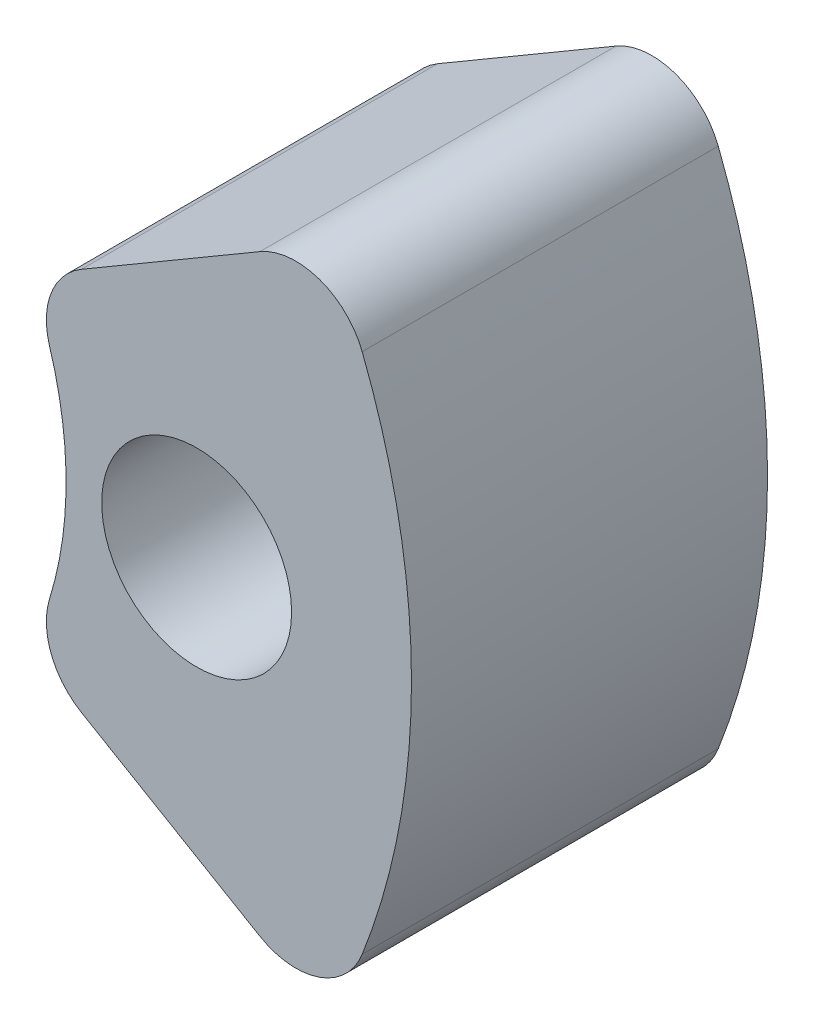
ISO-10303-21;
HEADER;
FILE_DESCRIPTION(('STEP AP214'),'2;1');
FILE_NAME('part.step','',(''),(''),'','','');
FILE_SCHEMA(('AUTOMOTIVE_DESIGN { 1 0 10303 214 1 1 1 1 }'));
ENDSEC;
DATA;
#1=APPLICATION_CONTEXT('core data for automotive mechanical design processes');
#2=APPLICATION_PROTOCOL_DEFINITION('international standard','automotive_design',2000,#1);
#3=PRODUCT_CONTEXT('',#1,'mechanical');
#4=PRODUCT('Part','Part','',(#3));
#5=PRODUCT_RELATED_PRODUCT_CATEGORY('part','',(#4));
#6=PRODUCT_DEFINITION_FORMATION('','',#4);
#7=PRODUCT_DEFINITION_CONTEXT('part definition',#1,'design');
#8=PRODUCT_DEFINITION('design','',#6,#7);
#9=PRODUCT_DEFINITION_SHAPE('','',#8);
#10=(LENGTH_UNIT() NAMED_UNIT(*) SI_UNIT(.MILLI.,.METRE.));
#11=(NAMED_UNIT(*) PLANE_ANGLE_UNIT() SI_UNIT($,.RADIAN.));
#12=(NAMED_UNIT(*) SI_UNIT($,.STERADIAN.) SOLID_ANGLE_UNIT());
#13=UNCERTAINTY_MEASURE_WITH_UNIT(LENGTH_MEASURE(1.E-05),#10,'distance_accuracy_value','');
#14=(GEOMETRIC_REPRESENTATION_CONTEXT(3) GLOBAL_UNCERTAINTY_ASSIGNED_CONTEXT((#13)) GLOBAL_UNIT_ASSIGNED_CONTEXT((#10,
#11,#12)) REPRESENTATION_CONTEXT('',''));
#15=CARTESIAN_POINT('',(0.,0.,0.));
#16=DIRECTION('',(0.,0.,1.));
#17=DIRECTION('',(1.,0.,0.));
#18=AXIS2_PLACEMENT_3D('',#15,#16,#17);
#19=CARTESIAN_POINT('',(25.280674437206,9.9,15.));
#20=DIRECTION('',(0.,0.,-1.));
#21=DIRECTION('',(-1.,0.,0.));
#22=AXIS2_PLACEMENT_3D('',#19,#20,#21);
#23=CYLINDRICAL_SURFACE('',#22,3.);
#24=CARTESIAN_POINT('',(25.280674437206,9.9,0.));
#25=DIRECTION('',(0.,0.,1.));
#26=DIRECTION('',(-1.,0.,0.));
#27=AXIS2_PLACEMENT_3D('',#24,#25,#26);
#28=CIRCLE('',#27,3.);
#29=CARTESIAN_POINT('',(28.0741191264,10.9939226519337,0.));
#30=VERTEX_POINT('',#29);
#31=CARTESIAN_POINT('',(23.7645025573319,12.4886720206853,0.));
#32=VERTEX_POINT('',#31);
#33=EDGE_CURVE('E141',#30,#32,#28,.T.);
#34=ORIENTED_EDGE('',*,*,#33,.T.);
#35=DIRECTION('',(0.,0.,-1.));
#36=VECTOR('',#35,1.);
#37=CARTESIAN_POINT('',(23.7645025573319,12.4886720206853,15.));
#38=LINE('',#37,#36);
#39=CARTESIAN_POINT('',(23.7645025573319,12.4886720206853,15.));
#40=VERTEX_POINT('',#39);
#41=EDGE_CURVE('E11',#40,#32,#38,.T.);
#42=ORIENTED_EDGE('',*,*,#41,.F.);
#43=CARTESIAN_POINT('',(25.280674437206,9.9,15.));
#44=DIRECTION('',(0.,0.,1.));
#45=DIRECTION('',(-1.,0.,0.));
#46=AXIS2_PLACEMENT_3D('',#43,#44,#45);
#47=CIRCLE('',#46,3.);
#48=CARTESIAN_POINT('',(28.0741191264,10.9939226519337,15.));
#49=VERTEX_POINT('',#48);
#50=EDGE_CURVE('E163',#49,#40,#47,.T.);
#51=ORIENTED_EDGE('',*,*,#50,.F.);
#52=DIRECTION('',(0.,0.,-1.));
#53=VECTOR('',#52,1.);
#54=CARTESIAN_POINT('',(28.0741191264,10.9939226519337,15.));
#55=LINE('',#54,#53);
#56=EDGE_CURVE('E137',#49,#30,#55,.T.);
#57=ORIENTED_EDGE('',*,*,#56,.T.);
#58=EDGE_LOOP('',(#34,#42,#51,#57));
#59=FACE_BOUND('',#58,.T.);
#60=ADVANCED_FACE('F39',(#59),#23,.T.);
#61=CARTESIAN_POINT('',(16.2520581951784,8.08867202068535,15.));
#62=DIRECTION('',(0.505390626624686,-0.862890673561783,0.));
#63=DIRECTION('',(0.862890673561783,0.505390626624686,0.));
#64=AXIS2_PLACEMENT_3D('',#61,#62,#63);
#65=PLANE('',#64);
#66=DIRECTION('',(-0.862890673561783,-0.505390626624686,0.));
#67=VECTOR('',#66,1.);
#68=CARTESIAN_POINT('',(16.2520581951784,8.08867202068535,0.));
#69=LINE('',#68,#67);
#70=CARTESIAN_POINT('',(16.2520581951784,8.08867202068535,0.));
#71=VERTEX_POINT('',#70);
#72=EDGE_CURVE('E145',#32,#71,#69,.T.);
#73=ORIENTED_EDGE('',*,*,#72,.T.);
#74=DIRECTION('',(0.,0.,-1.));
#75=VECTOR('',#74,1.);
#76=CARTESIAN_POINT('',(16.2520581951784,8.08867202068535,15.));
#77=LINE('',#76,#75);
#78=CARTESIAN_POINT('',(16.2520581951784,8.08867202068535,15.));
#79=VERTEX_POINT('',#78);
#80=EDGE_CURVE('E49',#79,#71,#77,.T.);
#81=ORIENTED_EDGE('',*,*,#80,.F.);
#82=DIRECTION('',(-0.862890673561783,-0.505390626624686,0.));
#83=VECTOR('',#82,1.);
#84=CARTESIAN_POINT('',(16.2520581951784,8.08867202068535,15.));
#85=LINE('',#84,#83);
#86=EDGE_CURVE('E100',#40,#79,#85,.T.);
#87=ORIENTED_EDGE('',*,*,#86,.F.);
#88=ORIENTED_EDGE('',*,*,#41,.T.);
#89=EDGE_LOOP('',(#73,#81,#87,#88));
#90=FACE_BOUND('',#89,.T.);
#91=ADVANCED_FACE('F236',(#90),#65,.F.);
#92=CARTESIAN_POINT('',(17.7682300750525,5.5,15.));
#93=DIRECTION('',(0.,0.,-1.));
#94=DIRECTION('',(-1.,0.,0.));
#95=AXIS2_PLACEMENT_3D('',#92,#93,#94);
#96=CYLINDRICAL_SURFACE('',#95,3.);
#97=CARTESIAN_POINT('',(17.7682300750525,5.5,0.));
#98=DIRECTION('',(0.,0.,1.));
#99=DIRECTION('',(1.,0.,0.));
#100=AXIS2_PLACEMENT_3D('',#97,#98,#99);
#101=CIRCLE('',#100,3.);
#102=CARTESIAN_POINT('',(14.9023865145602,4.61290322580645,0.));
#103=VERTEX_POINT('',#102);
#104=EDGE_CURVE('E148',#71,#103,#101,.T.);
#105=ORIENTED_EDGE('',*,*,#104,.T.);
#106=DIRECTION('',(0.,0.,-1.));
#107=VECTOR('',#106,1.);
#108=CARTESIAN_POINT('',(14.9023865145602,4.61290322580645,15.));
#109=LINE('',#108,#107);
#110=CARTESIAN_POINT('',(14.9023865145602,4.61290322580645,15.));
#111=VERTEX_POINT('',#110);
#112=EDGE_CURVE('E174',#111,#103,#109,.T.);
#113=ORIENTED_EDGE('',*,*,#112,.F.);
#114=CARTESIAN_POINT('',(17.7682300750525,5.5,15.));
#115=DIRECTION('',(0.,0.,1.));
#116=DIRECTION('',(1.,0.,0.));
#117=AXIS2_PLACEMENT_3D('',#114,#115,#116);
#118=CIRCLE('',#117,3.);
#119=EDGE_CURVE('E185',#79,#111,#118,.T.);
#120=ORIENTED_EDGE('',*,*,#119,.F.);
#121=ORIENTED_EDGE('',*,*,#80,.T.);
#122=EDGE_LOOP('',(#105,#113,#120,#121));
#123=FACE_BOUND('',#122,.T.);
#124=ADVANCED_FACE('F183',(#123),#96,.T.);
#125=CARTESIAN_POINT('',(0.,0.,15.));
#126=DIRECTION('',(0.,0.,-1.));
#127=DIRECTION('',(-1.,0.,0.));
#128=AXIS2_PLACEMENT_3D('',#125,#126,#127);
#129=CYLINDRICAL_SURFACE('',#128,15.6);
#130=CARTESIAN_POINT('',(0.,0.,0.));
#131=DIRECTION('',(0.,0.,-1.));
#132=DIRECTION('',(1.,0.,0.));
#133=AXIS2_PLACEMENT_3D('',#130,#131,#132);
#134=CIRCLE('',#133,15.6);
#135=CARTESIAN_POINT('',(14.9023865145602,-4.61290322580645,0.));
#136=VERTEX_POINT('',#135);
#137=EDGE_CURVE('E151',#103,#136,#134,.T.);
#138=ORIENTED_EDGE('',*,*,#137,.T.);
#139=DIRECTION('',(0.,0.,-1.));
#140=VECTOR('',#139,1.);
#141=CARTESIAN_POINT('',(14.9023865145602,-4.61290322580645,15.));
#142=LINE('',#141,#140);
#143=CARTESIAN_POINT('',(14.9023865145602,-4.61290322580645,15.));
#144=VERTEX_POINT('',#143);
#145=EDGE_CURVE('E170',#144,#136,#142,.T.);
#146=ORIENTED_EDGE('',*,*,#145,.F.);
#147=CARTESIAN_POINT('',(0.,0.,15.));
#148=DIRECTION('',(0.,0.,-1.));
#149=DIRECTION('',(1.,0.,0.));
#150=AXIS2_PLACEMENT_3D('',#147,#148,#149);
#151=CIRCLE('',#150,15.6);
#152=EDGE_CURVE('E198',#111,#144,#151,.T.);
#153=ORIENTED_EDGE('',*,*,#152,.F.);
#154=ORIENTED_EDGE('',*,*,#112,.T.);
#155=EDGE_LOOP('',(#138,#146,#153,#154));
#156=FACE_BOUND('',#155,.T.);
#157=ADVANCED_FACE('F193',(#156),#129,.F.);
#158=CARTESIAN_POINT('',(17.7682300750525,-5.5,15.));
#159=DIRECTION('',(0.,0.,-1.));
#160=DIRECTION('',(-1.,0.,0.));
#161=AXIS2_PLACEMENT_3D('',#158,#159,#160);
#162=CYLINDRICAL_SURFACE('',#161,3.);
#163=CARTESIAN_POINT('',(17.7682300750525,-5.5,0.));
#164=DIRECTION('',(0.,0.,1.));
#165=DIRECTION('',(-1.,0.,0.));
#166=AXIS2_PLACEMENT_3D('',#163,#164,#165);
#167=CIRCLE('',#166,3.);
#168=CARTESIAN_POINT('',(16.2520581951784,-8.08867202068535,0.));
#169=VERTEX_POINT('',#168);
#170=EDGE_CURVE('E154',#136,#169,#167,.T.);
#171=ORIENTED_EDGE('',*,*,#170,.T.);
#172=DIRECTION('',(0.,0.,-1.));
#173=VECTOR('',#172,1.);
#174=CARTESIAN_POINT('',(16.2520581951784,-8.08867202068535,15.));
#175=LINE('',#174,#173);
#176=CARTESIAN_POINT('',(16.2520581951784,-8.08867202068535,15.));
#177=VERTEX_POINT('',#176);
#178=EDGE_CURVE('E130',#177,#169,#175,.T.);
#179=ORIENTED_EDGE('',*,*,#178,.F.);
#180=CARTESIAN_POINT('',(17.7682300750525,-5.5,15.));
#181=DIRECTION('',(0.,0.,1.));
#182=DIRECTION('',(-1.,0.,0.));
#183=AXIS2_PLACEMENT_3D('',#180,#181,#182);
#184=CIRCLE('',#183,3.);
#185=EDGE_CURVE('E119',#144,#177,#184,.T.);
#186=ORIENTED_EDGE('',*,*,#185,.F.);
#187=ORIENTED_EDGE('',*,*,#145,.T.);
#188=EDGE_LOOP('',(#171,#179,#186,#187));
#189=FACE_BOUND('',#188,.T.);
#190=ADVANCED_FACE('F196',(#189),#162,.T.);
#191=CARTESIAN_POINT('',(16.2520581951784,-8.08867202068535,15.));
#192=DIRECTION('',(0.505390626624686,0.862890673561783,0.));
#193=DIRECTION('',(-0.862890673561783,0.505390626624686,0.));
#194=AXIS2_PLACEMENT_3D('',#191,#192,#193);
#195=PLANE('',#194);
#196=DIRECTION('',(0.862890673561783,-0.505390626624686,0.));
#197=VECTOR('',#196,1.);
#198=CARTESIAN_POINT('',(16.2520581951784,-8.08867202068535,0.));
#199=LINE('',#198,#197);
#200=CARTESIAN_POINT('',(23.7645025573319,-12.4886720206853,0.));
#201=VERTEX_POINT('',#200);
#202=EDGE_CURVE('E128',#169,#201,#199,.T.);
#203=ORIENTED_EDGE('',*,*,#202,.T.);
#204=DIRECTION('',(0.,0.,-1.));
#205=VECTOR('',#204,1.);
#206=CARTESIAN_POINT('',(23.7645025573319,-12.4886720206853,15.));
#207=LINE('',#206,#205);
#208=CARTESIAN_POINT('',(23.7645025573319,-12.4886720206853,15.));
#209=VERTEX_POINT('',#208);
#210=EDGE_CURVE('E125',#209,#201,#207,.T.);
#211=ORIENTED_EDGE('',*,*,#210,.F.);
#212=DIRECTION('',(0.862890673561783,-0.505390626624686,0.));
#213=VECTOR('',#212,1.);
#214=CARTESIAN_POINT('',(16.2520581951784,-8.08867202068535,15.));
#215=LINE('',#214,#213);
#216=EDGE_CURVE('E113',#177,#209,#215,.T.);
#217=ORIENTED_EDGE('',*,*,#216,.F.);
#218=ORIENTED_EDGE('',*,*,#178,.T.);
#219=EDGE_LOOP('',(#203,#211,#217,#218));
#220=FACE_BOUND('',#219,.T.);
#221=ADVANCED_FACE('F126',(#220),#195,.F.);
#222=CARTESIAN_POINT('',(25.280674437206,-9.9,15.));
#223=DIRECTION('',(0.,0.,-1.));
#224=DIRECTION('',(-1.,0.,0.));
#225=AXIS2_PLACEMENT_3D('',#222,#223,#224);
#226=CYLINDRICAL_SURFACE('',#225,3.);
#227=CARTESIAN_POINT('',(25.280674437206,-9.9,0.));
#228=DIRECTION('',(0.,0.,1.));
#229=DIRECTION('',(1.,0.,0.));
#230=AXIS2_PLACEMENT_3D('',#227,#228,#229);
#231=CIRCLE('',#230,3.);
#232=CARTESIAN_POINT('',(28.0741191264,-10.9939226519337,0.));
#233=VERTEX_POINT('',#232);
#234=EDGE_CURVE('E86',#201,#233,#231,.T.);
#235=ORIENTED_EDGE('',*,*,#234,.T.);
#236=DIRECTION('',(0.,0.,-1.));
#237=VECTOR('',#236,1.);
#238=CARTESIAN_POINT('',(28.0741191264,-10.9939226519337,15.));
#239=LINE('',#238,#237);
#240=CARTESIAN_POINT('',(28.0741191264,-10.9939226519337,15.));
#241=VERTEX_POINT('',#240);
#242=EDGE_CURVE('E131',#241,#233,#239,.T.);
#243=ORIENTED_EDGE('',*,*,#242,.F.);
#244=CARTESIAN_POINT('',(25.280674437206,-9.9,15.));
#245=DIRECTION('',(0.,0.,1.));
#246=DIRECTION('',(1.,0.,0.));
#247=AXIS2_PLACEMENT_3D('',#244,#245,#246);
#248=CIRCLE('',#247,3.);
#249=EDGE_CURVE('E117',#209,#241,#248,.T.);
#250=ORIENTED_EDGE('',*,*,#249,.F.);
#251=ORIENTED_EDGE('',*,*,#210,.T.);
#252=EDGE_LOOP('',(#235,#243,#250,#251));
#253=FACE_BOUND('',#252,.T.);
#254=ADVANCED_FACE('F133',(#253),#226,.T.);
#255=CARTESIAN_POINT('',(0.,0.,15.));
#256=DIRECTION('',(0.,0.,-1.));
#257=DIRECTION('',(-1.,0.,0.));
#258=AXIS2_PLACEMENT_3D('',#255,#256,#257);
#259=CYLINDRICAL_SURFACE('',#258,30.15);
#260=CARTESIAN_POINT('',(0.,0.,0.));
#261=DIRECTION('',(0.,0.,1.));
#262=DIRECTION('',(1.,0.,0.));
#263=AXIS2_PLACEMENT_3D('',#260,#261,#262);
#264=CIRCLE('',#263,30.15);
#265=EDGE_CURVE('E92',#233,#30,#264,.T.);
#266=ORIENTED_EDGE('',*,*,#265,.T.);
#267=ORIENTED_EDGE('',*,*,#56,.F.);
#268=CARTESIAN_POINT('',(0.,0.,15.));
#269=DIRECTION('',(0.,0.,1.));
#270=DIRECTION('',(1.,0.,0.));
#271=AXIS2_PLACEMENT_3D('',#268,#269,#270);
#272=CIRCLE('',#271,30.15);
#273=EDGE_CURVE('E57',#241,#49,#272,.T.);
#274=ORIENTED_EDGE('',*,*,#273,.F.);
#275=ORIENTED_EDGE('',*,*,#242,.T.);
#276=EDGE_LOOP('',(#266,#267,#274,#275));
#277=FACE_BOUND('',#276,.T.);
#278=ADVANCED_FACE('F224',(#277),#259,.T.);
#279=CARTESIAN_POINT('',(25.280674437206,9.9,15.));
#280=DIRECTION('',(0.,0.,-1.));
#281=DIRECTION('',(-1.,0.,0.));
#282=AXIS2_PLACEMENT_3D('',#279,#280,#281);
#283=PLANE('',#282);
#284=CARTESIAN_POINT('',(21.1,0.,15.));
#285=DIRECTION('',(0.,0.,1.));
#286=DIRECTION('',(1.,0.,0.));
#287=AXIS2_PLACEMENT_3D('',#284,#285,#286);
#288=CIRCLE('',#287,3.99999999999999);
#289=CARTESIAN_POINT('',(25.1,0.,15.));
#290=VERTEX_POINT('',#289);
#291=EDGE_CURVE('E216',#290,#290,#288,.T.);
#292=ORIENTED_EDGE('',*,*,#291,.F.);
#293=EDGE_LOOP('',(#292));
#294=FACE_BOUND('',#293,.T.);
#295=ORIENTED_EDGE('',*,*,#50,.T.);
#296=ORIENTED_EDGE('',*,*,#86,.T.);
#297=ORIENTED_EDGE('',*,*,#119,.T.);
#298=ORIENTED_EDGE('',*,*,#152,.T.);
#299=ORIENTED_EDGE('',*,*,#185,.T.);
#300=ORIENTED_EDGE('',*,*,#216,.T.);
#301=ORIENTED_EDGE('',*,*,#249,.T.);
#302=ORIENTED_EDGE('',*,*,#273,.T.);
#303=EDGE_LOOP('',(#295,#296,#297,#298,#299,#300,#301,#302));
#304=FACE_BOUND('',#303,.T.);
#305=ADVANCED_FACE('F115',(#294,#304),#283,.F.);
#306=CARTESIAN_POINT('',(25.280674437206,9.9,0.));
#307=DIRECTION('',(0.,0.,-1.));
#308=DIRECTION('',(-1.,0.,0.));
#309=AXIS2_PLACEMENT_3D('',#306,#307,#308);
#310=PLANE('',#309);
#311=CARTESIAN_POINT('',(21.1,0.,0.));
#312=DIRECTION('',(0.,0.,-1.));
#313=DIRECTION('',(-1.,0.,0.));
#314=AXIS2_PLACEMENT_3D('',#311,#312,#313);
#315=CIRCLE('',#314,2.24999999999999);
#316=CARTESIAN_POINT('',(18.85,0.,0.));
#317=VERTEX_POINT('',#316);
#318=EDGE_CURVE('E42',#317,#317,#315,.T.);
#319=ORIENTED_EDGE('',*,*,#318,.F.);
#320=EDGE_LOOP('',(#319));
#321=FACE_BOUND('',#320,.T.);
#322=ORIENTED_EDGE('',*,*,#33,.F.);
#323=ORIENTED_EDGE('',*,*,#265,.F.);
#324=ORIENTED_EDGE('',*,*,#234,.F.);
#325=ORIENTED_EDGE('',*,*,#202,.F.);
#326=ORIENTED_EDGE('',*,*,#170,.F.);
#327=ORIENTED_EDGE('',*,*,#137,.F.);
#328=ORIENTED_EDGE('',*,*,#104,.F.);
#329=ORIENTED_EDGE('',*,*,#72,.F.);
#330=EDGE_LOOP('',(#322,#323,#324,#325,#326,#327,#328,#329));
#331=FACE_BOUND('',#330,.T.);
#332=ADVANCED_FACE('F189',(#321,#331),#310,.T.);
#333=CARTESIAN_POINT('',(21.1,0.,15.));
#334=DIRECTION('',(0.,0.,1.));
#335=DIRECTION('',(1.,0.,0.));
#336=AXIS2_PLACEMENT_3D('',#333,#334,#335);
#337=CYLINDRICAL_SURFACE('',#336,2.24999999999999);
#338=ORIENTED_EDGE('',*,*,#318,.T.);
#339=EDGE_LOOP('',(#338));
#340=FACE_BOUND('',#339,.T.);
#341=CARTESIAN_POINT('',(21.1,0.,6.));
#342=DIRECTION('',(0.,0.,1.));
#343=DIRECTION('',(1.,0.,0.));
#344=AXIS2_PLACEMENT_3D('',#341,#342,#343);
#345=CIRCLE('',#344,2.25);
#346=CARTESIAN_POINT('',(23.35,0.,6.));
#347=VERTEX_POINT('',#346);
#348=EDGE_CURVE('E208',#347,#347,#345,.T.);
#349=ORIENTED_EDGE('',*,*,#348,.T.);
#350=EDGE_LOOP('',(#349));
#351=FACE_BOUND('',#350,.T.);
#352=ADVANCED_FACE('F230',(#340,#351),#337,.F.);
#353=CARTESIAN_POINT('',(23.35,0.,6.));
#354=DIRECTION('',(0.,0.,-1.));
#355=DIRECTION('',(-1.,0.,0.));
#356=AXIS2_PLACEMENT_3D('',#353,#354,#355);
#357=PLANE('',#356);
#358=ORIENTED_EDGE('',*,*,#348,.F.);
#359=EDGE_LOOP('',(#358));
#360=FACE_BOUND('',#359,.T.);
#361=CARTESIAN_POINT('',(21.1,0.,6.));
#362=DIRECTION('',(0.,0.,1.));
#363=DIRECTION('',(1.,0.,0.));
#364=AXIS2_PLACEMENT_3D('',#361,#362,#363);
#365=CIRCLE('',#364,4.);
#366=CARTESIAN_POINT('',(25.1,0.,6.));
#367=VERTEX_POINT('',#366);
#368=EDGE_CURVE('E212',#367,#367,#365,.T.);
#369=ORIENTED_EDGE('',*,*,#368,.T.);
#370=EDGE_LOOP('',(#369));
#371=FACE_BOUND('',#370,.T.);
#372=ADVANCED_FACE('F282',(#360,#371),#357,.F.);
#373=CARTESIAN_POINT('',(21.1,0.,15.));
#374=DIRECTION('',(0.,0.,1.));
#375=DIRECTION('',(1.,0.,0.));
#376=AXIS2_PLACEMENT_3D('',#373,#374,#375);
#377=CYLINDRICAL_SURFACE('',#376,3.99999999999999);
#378=ORIENTED_EDGE('',*,*,#368,.F.);
#379=EDGE_LOOP('',(#378));
#380=FACE_BOUND('',#379,.T.);
#381=ORIENTED_EDGE('',*,*,#291,.T.);
#382=EDGE_LOOP('',(#381));
#383=FACE_BOUND('',#382,.T.);
#384=ADVANCED_FACE('F221',(#380,#383),#377,.F.);
#385=CLOSED_SHELL('',(#60,#91,#124,#157,#190,#221,#254,#278,#305,#332,#352,#372,#384));
#386=MANIFOLD_SOLID_BREP('B2',#385);
#387=ADVANCED_BREP_SHAPE_REPRESENTATION('',(#18,#386),#14);
#388=SHAPE_DEFINITION_REPRESENTATION(#9,#387);
ENDSEC;
END-ISO-10303-21;
